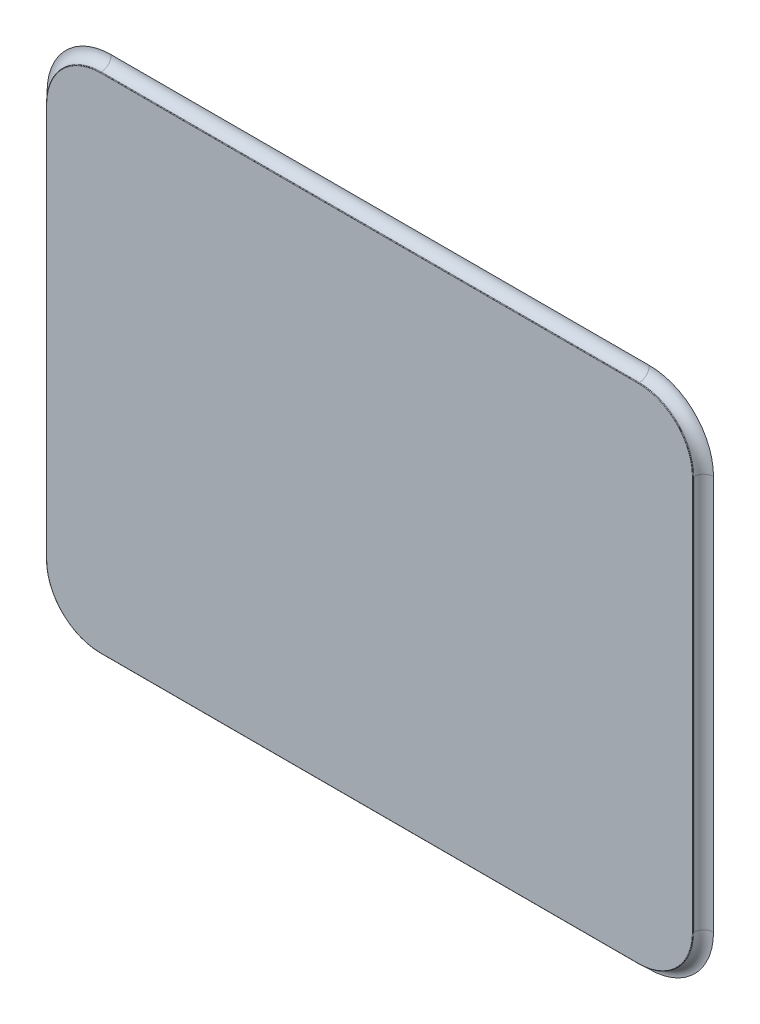
ISO-10303-21;
HEADER;
FILE_DESCRIPTION(('STEP AP214'),'2;1');
FILE_NAME('part.step','',(''),(''),'','','');
FILE_SCHEMA(('AUTOMOTIVE_DESIGN { 1 0 10303 214 1 1 1 1 }'));
ENDSEC;
DATA;
#1=APPLICATION_CONTEXT('core data for automotive mechanical design processes');
#2=APPLICATION_PROTOCOL_DEFINITION('international standard','automotive_design',2000,#1);
#3=PRODUCT_CONTEXT('',#1,'mechanical');
#4=PRODUCT('Part','Part','',(#3));
#5=PRODUCT_RELATED_PRODUCT_CATEGORY('part','',(#4));
#6=PRODUCT_DEFINITION_FORMATION('','',#4);
#7=PRODUCT_DEFINITION_CONTEXT('part definition',#1,'design');
#8=PRODUCT_DEFINITION('design','',#6,#7);
#9=PRODUCT_DEFINITION_SHAPE('','',#8);
#10=(LENGTH_UNIT() NAMED_UNIT(*) SI_UNIT(.MILLI.,.METRE.));
#11=(NAMED_UNIT(*) PLANE_ANGLE_UNIT() SI_UNIT($,.RADIAN.));
#12=(NAMED_UNIT(*) SI_UNIT($,.STERADIAN.) SOLID_ANGLE_UNIT());
#13=UNCERTAINTY_MEASURE_WITH_UNIT(LENGTH_MEASURE(1.E-05),#10,'distance_accuracy_value','');
#14=(GEOMETRIC_REPRESENTATION_CONTEXT(3) GLOBAL_UNCERTAINTY_ASSIGNED_CONTEXT((#13)) GLOBAL_UNIT_ASSIGNED_CONTEXT((#10,
#11,#12)) REPRESENTATION_CONTEXT('',''));
#15=CARTESIAN_POINT('',(0.,0.,0.));
#16=DIRECTION('',(0.,0.,1.));
#17=DIRECTION('',(1.,0.,0.));
#18=AXIS2_PLACEMENT_3D('',#15,#16,#17);
#19=CARTESIAN_POINT('',(-0.9015,-0.7015,0.3));
#20=DIRECTION('',(0.,1.,0.));
#21=DIRECTION('',(0.,0.,1.));
#22=AXIS2_PLACEMENT_3D('',#19,#20,#21);
#23=PLANE('',#22);
#24=DIRECTION('',(0.,0.,1.));
#25=VECTOR('',#24,1.);
#26=CARTESIAN_POINT('',(-0.75,-0.7015,0.3));
#27=LINE('',#26,#25);
#28=CARTESIAN_POINT('',(-0.75,-0.7015,0.3275));
#29=VERTEX_POINT('',#28);
#30=CARTESIAN_POINT('',(-0.75,-0.7015,0.3285));
#31=VERTEX_POINT('',#30);
#32=EDGE_CURVE('E34',#29,#31,#27,.T.);
#33=ORIENTED_EDGE('',*,*,#32,.F.);
#34=DIRECTION('',(1.,0.,0.));
#35=VECTOR('',#34,1.);
#36=CARTESIAN_POINT('',(-0.75,-0.7015,0.3275));
#37=LINE('',#36,#35);
#38=CARTESIAN_POINT('',(0.75,-0.7015,0.3275));
#39=VERTEX_POINT('',#38);
#40=EDGE_CURVE('E10',#29,#39,#37,.T.);
#41=ORIENTED_EDGE('',*,*,#40,.T.);
#42=DIRECTION('',(0.,0.,1.));
#43=VECTOR('',#42,1.);
#44=CARTESIAN_POINT('',(0.75,-0.7015,0.3));
#45=LINE('',#44,#43);
#46=CARTESIAN_POINT('',(0.75,-0.7015,0.3285));
#47=VERTEX_POINT('',#46);
#48=EDGE_CURVE('E26',#39,#47,#45,.T.);
#49=ORIENTED_EDGE('',*,*,#48,.T.);
#50=DIRECTION('',(1.,0.,0.));
#51=VECTOR('',#50,1.);
#52=CARTESIAN_POINT('',(-0.75,-0.7015,0.3285));
#53=LINE('',#52,#51);
#54=EDGE_CURVE('E282',#31,#47,#53,.T.);
#55=ORIENTED_EDGE('',*,*,#54,.F.);
#56=EDGE_LOOP('',(#33,#41,#49,#55));
#57=FACE_BOUND('',#56,.T.);
#58=ADVANCED_FACE('F16',(#57),#23,.F.);
#59=CARTESIAN_POINT('',(-0.75,-0.55,0.3));
#60=DIRECTION('',(0.,0.,1.));
#61=DIRECTION('',(1.,0.,0.));
#62=AXIS2_PLACEMENT_3D('',#59,#60,#61);
#63=CYLINDRICAL_SURFACE('',#62,0.1515);
#64=DIRECTION('',(0.,0.,1.));
#65=VECTOR('',#64,1.);
#66=CARTESIAN_POINT('',(-0.9015,-0.55,0.3));
#67=LINE('',#66,#65);
#68=CARTESIAN_POINT('',(-0.9015,-0.55,0.3275));
#69=VERTEX_POINT('',#68);
#70=CARTESIAN_POINT('',(-0.9015,-0.55,0.3285));
#71=VERTEX_POINT('',#70);
#72=EDGE_CURVE('E258',#69,#71,#67,.T.);
#73=ORIENTED_EDGE('',*,*,#72,.F.);
#74=CARTESIAN_POINT('',(-0.75,-0.55,0.3275));
#75=DIRECTION('',(0.,0.,1.));
#76=DIRECTION('',(1.,0.,0.));
#77=AXIS2_PLACEMENT_3D('',#74,#75,#76);
#78=CIRCLE('',#77,0.1515);
#79=EDGE_CURVE('E286',#69,#29,#78,.T.);
#80=ORIENTED_EDGE('',*,*,#79,.T.);
#81=ORIENTED_EDGE('',*,*,#32,.T.);
#82=CARTESIAN_POINT('',(-0.75,-0.55,0.3285));
#83=DIRECTION('',(0.,0.,1.));
#84=DIRECTION('',(1.,0.,0.));
#85=AXIS2_PLACEMENT_3D('',#82,#83,#84);
#86=CIRCLE('',#85,0.1515);
#87=EDGE_CURVE('E259',#71,#31,#86,.T.);
#88=ORIENTED_EDGE('',*,*,#87,.F.);
#89=EDGE_LOOP('',(#73,#80,#81,#88));
#90=FACE_BOUND('',#89,.T.);
#91=ADVANCED_FACE('F298',(#90),#63,.T.);
#92=CARTESIAN_POINT('',(-0.75,-0.7,0.3285));
#93=DIRECTION('',(1.,0.,0.));
#94=DIRECTION('',(0.,1.,0.));
#95=AXIS2_PLACEMENT_3D('',#92,#93,#94);
#96=CYLINDRICAL_SURFACE('',#95,0.0015);
#97=CARTESIAN_POINT('',(-0.75,-0.7,0.3285));
#98=DIRECTION('',(-1.,0.,0.));
#99=DIRECTION('',(0.,0.,1.));
#100=AXIS2_PLACEMENT_3D('',#97,#98,#99);
#101=CIRCLE('',#100,0.0015);
#102=CARTESIAN_POINT('',(-0.75,-0.7,0.33));
#103=VERTEX_POINT('',#102);
#104=EDGE_CURVE('E249',#31,#103,#101,.T.);
#105=ORIENTED_EDGE('',*,*,#104,.F.);
#106=ORIENTED_EDGE('',*,*,#54,.T.);
#107=CARTESIAN_POINT('',(0.75,-0.7,0.3285));
#108=DIRECTION('',(-1.,0.,0.));
#109=DIRECTION('',(0.,0.,1.));
#110=AXIS2_PLACEMENT_3D('',#107,#108,#109);
#111=CIRCLE('',#110,0.0015);
#112=CARTESIAN_POINT('',(0.75,-0.7,0.33));
#113=VERTEX_POINT('',#112);
#114=EDGE_CURVE('E276',#47,#113,#111,.T.);
#115=ORIENTED_EDGE('',*,*,#114,.T.);
#116=DIRECTION('',(1.,0.,0.));
#117=VECTOR('',#116,1.);
#118=CARTESIAN_POINT('',(-0.75,-0.7,0.33));
#119=LINE('',#118,#117);
#120=EDGE_CURVE('E245',#103,#113,#119,.T.);
#121=ORIENTED_EDGE('',*,*,#120,.F.);
#122=EDGE_LOOP('',(#105,#106,#115,#121));
#123=FACE_BOUND('',#122,.T.);
#124=ADVANCED_FACE('F302',(#123),#96,.T.);
#125=CARTESIAN_POINT('',(-0.75,-0.729,0.3275));
#126=DIRECTION('',(1.,0.,0.));
#127=DIRECTION('',(0.,1.,0.));
#128=AXIS2_PLACEMENT_3D('',#125,#126,#127);
#129=CYLINDRICAL_SURFACE('',#128,0.0275);
#130=CARTESIAN_POINT('',(-0.75,-0.729,0.3275));
#131=DIRECTION('',(1.,0.,0.));
#132=DIRECTION('',(0.,1.,0.));
#133=AXIS2_PLACEMENT_3D('',#130,#131,#132);
#134=CIRCLE('',#133,0.0275);
#135=CARTESIAN_POINT('',(-0.75,-0.729,0.3));
#136=VERTEX_POINT('',#135);
#137=EDGE_CURVE('E250',#136,#29,#134,.T.);
#138=ORIENTED_EDGE('',*,*,#137,.F.);
#139=DIRECTION('',(1.,0.,0.));
#140=VECTOR('',#139,1.);
#141=CARTESIAN_POINT('',(-0.75,-0.729,0.3));
#142=LINE('',#141,#140);
#143=CARTESIAN_POINT('',(0.75,-0.729,0.3));
#144=VERTEX_POINT('',#143);
#145=EDGE_CURVE('E273',#136,#144,#142,.T.);
#146=ORIENTED_EDGE('',*,*,#145,.T.);
#147=CARTESIAN_POINT('',(0.75,-0.729,0.3275));
#148=DIRECTION('',(1.,0.,0.));
#149=DIRECTION('',(0.,1.,0.));
#150=AXIS2_PLACEMENT_3D('',#147,#148,#149);
#151=CIRCLE('',#150,0.0275);
#152=EDGE_CURVE('E271',#144,#39,#151,.T.);
#153=ORIENTED_EDGE('',*,*,#152,.T.);
#154=ORIENTED_EDGE('',*,*,#40,.F.);
#155=EDGE_LOOP('',(#138,#146,#153,#154));
#156=FACE_BOUND('',#155,.T.);
#157=ADVANCED_FACE('F341',(#156),#129,.F.);
#158=CARTESIAN_POINT('',(0.75,-0.55,0.3));
#159=DIRECTION('',(0.,0.,1.));
#160=DIRECTION('',(1.,0.,0.));
#161=AXIS2_PLACEMENT_3D('',#158,#159,#160);
#162=CYLINDRICAL_SURFACE('',#161,0.1515);
#163=DIRECTION('',(0.,0.,1.));
#164=VECTOR('',#163,1.);
#165=CARTESIAN_POINT('',(0.9015,-0.55,0.3));
#166=LINE('',#165,#164);
#167=CARTESIAN_POINT('',(0.9015,-0.55,0.3275));
#168=VERTEX_POINT('',#167);
#169=CARTESIAN_POINT('',(0.9015,-0.55,0.3285));
#170=VERTEX_POINT('',#169);
#171=EDGE_CURVE('E266',#168,#170,#166,.T.);
#172=ORIENTED_EDGE('',*,*,#171,.T.);
#173=CARTESIAN_POINT('',(0.75,-0.55,0.3285));
#174=DIRECTION('',(0.,0.,1.));
#175=DIRECTION('',(1.,0.,0.));
#176=AXIS2_PLACEMENT_3D('',#173,#174,#175);
#177=CIRCLE('',#176,0.1515);
#178=EDGE_CURVE('E225',#47,#170,#177,.T.);
#179=ORIENTED_EDGE('',*,*,#178,.F.);
#180=ORIENTED_EDGE('',*,*,#48,.F.);
#181=CARTESIAN_POINT('',(0.75,-0.55,0.3275));
#182=DIRECTION('',(0.,0.,1.));
#183=DIRECTION('',(1.,0.,0.));
#184=AXIS2_PLACEMENT_3D('',#181,#182,#183);
#185=CIRCLE('',#184,0.1515);
#186=EDGE_CURVE('E263',#39,#168,#185,.T.);
#187=ORIENTED_EDGE('',*,*,#186,.T.);
#188=EDGE_LOOP('',(#172,#179,#180,#187));
#189=FACE_BOUND('',#188,.T.);
#190=ADVANCED_FACE('F338',(#189),#162,.T.);
#191=CARTESIAN_POINT('',(-0.9015,-0.7015,0.3));
#192=DIRECTION('',(1.,0.,0.));
#193=DIRECTION('',(0.,0.,-1.));
#194=AXIS2_PLACEMENT_3D('',#191,#192,#193);
#195=PLANE('',#194);
#196=ORIENTED_EDGE('',*,*,#72,.T.);
#197=DIRECTION('',(0.,-1.,0.));
#198=VECTOR('',#197,1.);
#199=CARTESIAN_POINT('',(-0.9015,0.55,0.3285));
#200=LINE('',#199,#198);
#201=CARTESIAN_POINT('',(-0.9015,0.55,0.3285));
#202=VERTEX_POINT('',#201);
#203=EDGE_CURVE('E207',#202,#71,#200,.T.);
#204=ORIENTED_EDGE('',*,*,#203,.F.);
#205=DIRECTION('',(0.,0.,1.));
#206=VECTOR('',#205,1.);
#207=CARTESIAN_POINT('',(-0.9015,0.55,0.3));
#208=LINE('',#207,#206);
#209=CARTESIAN_POINT('',(-0.9015,0.55,0.3275));
#210=VERTEX_POINT('',#209);
#211=EDGE_CURVE('E172',#210,#202,#208,.T.);
#212=ORIENTED_EDGE('',*,*,#211,.F.);
#213=DIRECTION('',(0.,-1.,0.));
#214=VECTOR('',#213,1.);
#215=CARTESIAN_POINT('',(-0.9015,0.55,0.3275));
#216=LINE('',#215,#214);
#217=EDGE_CURVE('E256',#210,#69,#216,.T.);
#218=ORIENTED_EDGE('',*,*,#217,.T.);
#219=EDGE_LOOP('',(#196,#204,#212,#218));
#220=FACE_BOUND('',#219,.T.);
#221=ADVANCED_FACE('F314',(#220),#195,.F.);
#222=CARTESIAN_POINT('',(-0.75,-0.55,0.3285));
#223=DIRECTION('',(0.,0.,1.));
#224=DIRECTION('',(1.,0.,0.));
#225=AXIS2_PLACEMENT_3D('',#222,#223,#224);
#226=TOROIDAL_SURFACE('',#225,0.15,0.0015);
#227=CARTESIAN_POINT('',(-0.9,-0.55,0.3285));
#228=DIRECTION('',(0.,1.,0.));
#229=DIRECTION('',(1.,0.,0.));
#230=AXIS2_PLACEMENT_3D('',#227,#228,#229);
#231=CIRCLE('',#230,0.0015);
#232=CARTESIAN_POINT('',(-0.9,-0.55,0.33));
#233=VERTEX_POINT('',#232);
#234=EDGE_CURVE('E221',#71,#233,#231,.T.);
#235=ORIENTED_EDGE('',*,*,#234,.F.);
#236=ORIENTED_EDGE('',*,*,#87,.T.);
#237=ORIENTED_EDGE('',*,*,#104,.T.);
#238=CARTESIAN_POINT('',(-0.75,-0.55,0.33));
#239=DIRECTION('',(0.,0.,1.));
#240=DIRECTION('',(1.,0.,0.));
#241=AXIS2_PLACEMENT_3D('',#238,#239,#240);
#242=CIRCLE('',#241,0.15);
#243=EDGE_CURVE('E230',#233,#103,#242,.T.);
#244=ORIENTED_EDGE('',*,*,#243,.F.);
#245=EDGE_LOOP('',(#235,#236,#237,#244));
#246=FACE_BOUND('',#245,.T.);
#247=ADVANCED_FACE('F306',(#246),#226,.T.);
#248=CARTESIAN_POINT('',(-0.75,-0.55,0.3275));
#249=DIRECTION('',(0.,0.,-1.));
#250=DIRECTION('',(0.,-1.,0.));
#251=AXIS2_PLACEMENT_3D('',#248,#249,#250);
#252=TOROIDAL_SURFACE('',#251,0.179,0.0275);
#253=CARTESIAN_POINT('',(-0.929,-0.55,0.3275));
#254=DIRECTION('',(0.,-1.,0.));
#255=DIRECTION('',(0.,0.,-1.));
#256=AXIS2_PLACEMENT_3D('',#253,#254,#255);
#257=CIRCLE('',#256,0.0275);
#258=CARTESIAN_POINT('',(-0.929,-0.55,0.3));
#259=VERTEX_POINT('',#258);
#260=EDGE_CURVE('E222',#259,#69,#257,.T.);
#261=ORIENTED_EDGE('',*,*,#260,.F.);
#262=CARTESIAN_POINT('',(-0.75,-0.55,0.3));
#263=DIRECTION('',(0.,0.,1.));
#264=DIRECTION('',(1.,0.,0.));
#265=AXIS2_PLACEMENT_3D('',#262,#263,#264);
#266=CIRCLE('',#265,0.179);
#267=EDGE_CURVE('E246',#259,#136,#266,.T.);
#268=ORIENTED_EDGE('',*,*,#267,.T.);
#269=ORIENTED_EDGE('',*,*,#137,.T.);
#270=ORIENTED_EDGE('',*,*,#79,.F.);
#271=EDGE_LOOP('',(#261,#268,#269,#270));
#272=FACE_BOUND('',#271,.T.);
#273=ADVANCED_FACE('F344',(#272),#252,.F.);
#274=CARTESIAN_POINT('',(-0.9015,-0.7015,0.33));
#275=DIRECTION('',(0.,0.,1.));
#276=DIRECTION('',(1.,0.,0.));
#277=AXIS2_PLACEMENT_3D('',#274,#275,#276);
#278=PLANE('',#277);
#279=ORIENTED_EDGE('',*,*,#120,.T.);
#280=CARTESIAN_POINT('',(0.75,-0.55,0.33));
#281=DIRECTION('',(0.,0.,1.));
#282=DIRECTION('',(1.,0.,0.));
#283=AXIS2_PLACEMENT_3D('',#280,#281,#282);
#284=CIRCLE('',#283,0.15);
#285=CARTESIAN_POINT('',(0.9,-0.55,0.33));
#286=VERTEX_POINT('',#285);
#287=EDGE_CURVE('E242',#113,#286,#284,.T.);
#288=ORIENTED_EDGE('',*,*,#287,.T.);
#289=DIRECTION('',(0.,1.,0.));
#290=VECTOR('',#289,1.);
#291=CARTESIAN_POINT('',(0.9,-0.55,0.33));
#292=LINE('',#291,#290);
#293=CARTESIAN_POINT('',(0.9,0.55,0.33));
#294=VERTEX_POINT('',#293);
#295=EDGE_CURVE('E239',#286,#294,#292,.T.);
#296=ORIENTED_EDGE('',*,*,#295,.T.);
#297=CARTESIAN_POINT('',(0.75,0.55,0.33));
#298=DIRECTION('',(0.,0.,1.));
#299=DIRECTION('',(1.,0.,0.));
#300=AXIS2_PLACEMENT_3D('',#297,#298,#299);
#301=CIRCLE('',#300,0.15);
#302=CARTESIAN_POINT('',(0.75,0.7,0.33));
#303=VERTEX_POINT('',#302);
#304=EDGE_CURVE('E236',#294,#303,#301,.T.);
#305=ORIENTED_EDGE('',*,*,#304,.T.);
#306=DIRECTION('',(-1.,0.,0.));
#307=VECTOR('',#306,1.);
#308=CARTESIAN_POINT('',(0.75,0.7,0.33));
#309=LINE('',#308,#307);
#310=CARTESIAN_POINT('',(-0.75,0.7,0.33));
#311=VERTEX_POINT('',#310);
#312=EDGE_CURVE('E233',#303,#311,#309,.T.);
#313=ORIENTED_EDGE('',*,*,#312,.T.);
#314=CARTESIAN_POINT('',(-0.75,0.55,0.33));
#315=DIRECTION('',(0.,0.,1.));
#316=DIRECTION('',(1.,0.,0.));
#317=AXIS2_PLACEMENT_3D('',#314,#315,#316);
#318=CIRCLE('',#317,0.15);
#319=CARTESIAN_POINT('',(-0.9,0.55,0.33));
#320=VERTEX_POINT('',#319);
#321=EDGE_CURVE('E229',#311,#320,#318,.T.);
#322=ORIENTED_EDGE('',*,*,#321,.T.);
#323=DIRECTION('',(0.,-1.,0.));
#324=VECTOR('',#323,1.);
#325=CARTESIAN_POINT('',(-0.9,0.55,0.33));
#326=LINE('',#325,#324);
#327=EDGE_CURVE('E226',#320,#233,#326,.T.);
#328=ORIENTED_EDGE('',*,*,#327,.T.);
#329=ORIENTED_EDGE('',*,*,#243,.T.);
#330=EDGE_LOOP('',(#279,#288,#296,#305,#313,#322,#328,#329));
#331=FACE_BOUND('',#330,.T.);
#332=ADVANCED_FACE('F308',(#331),#278,.T.);
#333=CARTESIAN_POINT('',(0.75,-0.55,0.3285));
#334=DIRECTION('',(0.,0.,1.));
#335=DIRECTION('',(1.,0.,0.));
#336=AXIS2_PLACEMENT_3D('',#333,#334,#335);
#337=TOROIDAL_SURFACE('',#336,0.15,0.0015);
#338=ORIENTED_EDGE('',*,*,#114,.F.);
#339=ORIENTED_EDGE('',*,*,#178,.T.);
#340=CARTESIAN_POINT('',(0.9,-0.55,0.3285));
#341=DIRECTION('',(0.,-1.,0.));
#342=DIRECTION('',(-1.,0.,0.));
#343=AXIS2_PLACEMENT_3D('',#340,#341,#342);
#344=CIRCLE('',#343,0.0015);
#345=EDGE_CURVE('E201',#170,#286,#344,.T.);
#346=ORIENTED_EDGE('',*,*,#345,.T.);
#347=ORIENTED_EDGE('',*,*,#287,.F.);
#348=EDGE_LOOP('',(#338,#339,#346,#347));
#349=FACE_BOUND('',#348,.T.);
#350=ADVANCED_FACE('F377',(#349),#337,.T.);
#351=CARTESIAN_POINT('',(-1.,-0.8,0.3));
#352=DIRECTION('',(0.,0.,1.));
#353=DIRECTION('',(1.,0.,0.));
#354=AXIS2_PLACEMENT_3D('',#351,#352,#353);
#355=PLANE('',#354);
#356=ORIENTED_EDGE('',*,*,#267,.F.);
#357=DIRECTION('',(0.,-1.,0.));
#358=VECTOR('',#357,1.);
#359=CARTESIAN_POINT('',(-0.929,0.55,0.3));
#360=LINE('',#359,#358);
#361=CARTESIAN_POINT('',(-0.929,0.55,0.3));
#362=VERTEX_POINT('',#361);
#363=EDGE_CURVE('E218',#362,#259,#360,.T.);
#364=ORIENTED_EDGE('',*,*,#363,.F.);
#365=CARTESIAN_POINT('',(-0.75,0.55,0.3));
#366=DIRECTION('',(0.,0.,1.));
#367=DIRECTION('',(1.,0.,0.));
#368=AXIS2_PLACEMENT_3D('',#365,#366,#367);
#369=CIRCLE('',#368,0.179);
#370=CARTESIAN_POINT('',(-0.75,0.729,0.3));
#371=VERTEX_POINT('',#370);
#372=EDGE_CURVE('E180',#371,#362,#369,.T.);
#373=ORIENTED_EDGE('',*,*,#372,.F.);
#374=DIRECTION('',(-1.,0.,0.));
#375=VECTOR('',#374,1.);
#376=CARTESIAN_POINT('',(0.75,0.729,0.3));
#377=LINE('',#376,#375);
#378=CARTESIAN_POINT('',(0.75,0.729,0.3));
#379=VERTEX_POINT('',#378);
#380=EDGE_CURVE('E189',#379,#371,#377,.T.);
#381=ORIENTED_EDGE('',*,*,#380,.F.);
#382=CARTESIAN_POINT('',(0.75,0.55,0.3));
#383=DIRECTION('',(0.,0.,1.));
#384=DIRECTION('',(1.,0.,0.));
#385=AXIS2_PLACEMENT_3D('',#382,#383,#384);
#386=CIRCLE('',#385,0.179);
#387=CARTESIAN_POINT('',(0.929,0.55,0.3));
#388=VERTEX_POINT('',#387);
#389=EDGE_CURVE('E158',#388,#379,#386,.T.);
#390=ORIENTED_EDGE('',*,*,#389,.F.);
#391=DIRECTION('',(0.,1.,0.));
#392=VECTOR('',#391,1.);
#393=CARTESIAN_POINT('',(0.929,-0.55,0.3));
#394=LINE('',#393,#392);
#395=CARTESIAN_POINT('',(0.929,-0.55,0.3));
#396=VERTEX_POINT('',#395);
#397=EDGE_CURVE('E160',#396,#388,#394,.T.);
#398=ORIENTED_EDGE('',*,*,#397,.F.);
#399=CARTESIAN_POINT('',(0.75,-0.55,0.3));
#400=DIRECTION('',(0.,0.,1.));
#401=DIRECTION('',(1.,0.,0.));
#402=AXIS2_PLACEMENT_3D('',#399,#400,#401);
#403=CIRCLE('',#402,0.179);
#404=EDGE_CURVE('E198',#144,#396,#403,.T.);
#405=ORIENTED_EDGE('',*,*,#404,.F.);
#406=ORIENTED_EDGE('',*,*,#145,.F.);
#407=EDGE_LOOP('',(#356,#364,#373,#381,#390,#398,#405,#406));
#408=FACE_BOUND('',#407,.T.);
#409=ADVANCED_FACE('F348',(#408),#355,.F.);
#410=CARTESIAN_POINT('',(0.75,-0.55,0.3275));
#411=DIRECTION('',(0.,0.,-1.));
#412=DIRECTION('',(0.,-1.,0.));
#413=AXIS2_PLACEMENT_3D('',#410,#411,#412);
#414=TOROIDAL_SURFACE('',#413,0.179,0.0275);
#415=ORIENTED_EDGE('',*,*,#152,.F.);
#416=ORIENTED_EDGE('',*,*,#404,.T.);
#417=CARTESIAN_POINT('',(0.929,-0.55,0.3275));
#418=DIRECTION('',(0.,1.,0.));
#419=DIRECTION('',(1.,0.,0.));
#420=AXIS2_PLACEMENT_3D('',#417,#418,#419);
#421=CIRCLE('',#420,0.0275);
#422=EDGE_CURVE('E202',#396,#168,#421,.T.);
#423=ORIENTED_EDGE('',*,*,#422,.T.);
#424=ORIENTED_EDGE('',*,*,#186,.F.);
#425=EDGE_LOOP('',(#415,#416,#423,#424));
#426=FACE_BOUND('',#425,.T.);
#427=ADVANCED_FACE('F334',(#426),#414,.F.);
#428=CARTESIAN_POINT('',(0.9015,-0.7015,0.3));
#429=DIRECTION('',(1.,0.,0.));
#430=DIRECTION('',(0.,0.,-1.));
#431=AXIS2_PLACEMENT_3D('',#428,#429,#430);
#432=PLANE('',#431);
#433=ORIENTED_EDGE('',*,*,#171,.F.);
#434=DIRECTION('',(0.,1.,0.));
#435=VECTOR('',#434,1.);
#436=CARTESIAN_POINT('',(0.9015,-0.55,0.3275));
#437=LINE('',#436,#435);
#438=CARTESIAN_POINT('',(0.9015,0.55,0.3275));
#439=VERTEX_POINT('',#438);
#440=EDGE_CURVE('E204',#168,#439,#437,.T.);
#441=ORIENTED_EDGE('',*,*,#440,.T.);
#442=DIRECTION('',(0.,0.,1.));
#443=VECTOR('',#442,1.);
#444=CARTESIAN_POINT('',(0.9015,0.55,0.3));
#445=LINE('',#444,#443);
#446=CARTESIAN_POINT('',(0.9015,0.55,0.3285));
#447=VERTEX_POINT('',#446);
#448=EDGE_CURVE('E151',#439,#447,#445,.T.);
#449=ORIENTED_EDGE('',*,*,#448,.T.);
#450=DIRECTION('',(0.,1.,0.));
#451=VECTOR('',#450,1.);
#452=CARTESIAN_POINT('',(0.9015,-0.55,0.3285));
#453=LINE('',#452,#451);
#454=EDGE_CURVE('E173',#170,#447,#453,.T.);
#455=ORIENTED_EDGE('',*,*,#454,.F.);
#456=EDGE_LOOP('',(#433,#441,#449,#455));
#457=FACE_BOUND('',#456,.T.);
#458=ADVANCED_FACE('F330',(#457),#432,.T.);
#459=CARTESIAN_POINT('',(-0.9,0.55,0.3285));
#460=DIRECTION('',(0.,-1.,0.));
#461=DIRECTION('',(0.,0.,-1.));
#462=AXIS2_PLACEMENT_3D('',#459,#460,#461);
#463=CYLINDRICAL_SURFACE('',#462,0.0015);
#464=CARTESIAN_POINT('',(-0.9,0.55,0.3285));
#465=DIRECTION('',(0.,1.,0.));
#466=DIRECTION('',(1.,0.,0.));
#467=AXIS2_PLACEMENT_3D('',#464,#465,#466);
#468=CIRCLE('',#467,0.0015);
#469=EDGE_CURVE('E184',#202,#320,#468,.T.);
#470=ORIENTED_EDGE('',*,*,#469,.F.);
#471=ORIENTED_EDGE('',*,*,#203,.T.);
#472=ORIENTED_EDGE('',*,*,#234,.T.);
#473=ORIENTED_EDGE('',*,*,#327,.F.);
#474=EDGE_LOOP('',(#470,#471,#472,#473));
#475=FACE_BOUND('',#474,.T.);
#476=ADVANCED_FACE('F310',(#475),#463,.T.);
#477=CARTESIAN_POINT('',(-0.929,0.55,0.3275));
#478=DIRECTION('',(0.,-1.,0.));
#479=DIRECTION('',(0.,0.,-1.));
#480=AXIS2_PLACEMENT_3D('',#477,#478,#479);
#481=CYLINDRICAL_SURFACE('',#480,0.0275);
#482=CARTESIAN_POINT('',(-0.929,0.55,0.3275));
#483=DIRECTION('',(0.,-1.,0.));
#484=DIRECTION('',(-1.,0.,0.));
#485=AXIS2_PLACEMENT_3D('',#482,#483,#484);
#486=CIRCLE('',#485,0.0275);
#487=EDGE_CURVE('E211',#362,#210,#486,.T.);
#488=ORIENTED_EDGE('',*,*,#487,.F.);
#489=ORIENTED_EDGE('',*,*,#363,.T.);
#490=ORIENTED_EDGE('',*,*,#260,.T.);
#491=ORIENTED_EDGE('',*,*,#217,.F.);
#492=EDGE_LOOP('',(#488,#489,#490,#491));
#493=FACE_BOUND('',#492,.T.);
#494=ADVANCED_FACE('F350',(#493),#481,.F.);
#495=CARTESIAN_POINT('',(-0.75,0.55,0.3));
#496=DIRECTION('',(0.,0.,1.));
#497=DIRECTION('',(1.,0.,0.));
#498=AXIS2_PLACEMENT_3D('',#495,#496,#497);
#499=CYLINDRICAL_SURFACE('',#498,0.1515);
#500=ORIENTED_EDGE('',*,*,#211,.T.);
#501=CARTESIAN_POINT('',(-0.75,0.55,0.3285));
#502=DIRECTION('',(0.,0.,1.));
#503=DIRECTION('',(1.,0.,0.));
#504=AXIS2_PLACEMENT_3D('',#501,#502,#503);
#505=CIRCLE('',#504,0.1515);
#506=CARTESIAN_POINT('',(-0.75,0.7015,0.3285));
#507=VERTEX_POINT('',#506);
#508=EDGE_CURVE('E167',#507,#202,#505,.T.);
#509=ORIENTED_EDGE('',*,*,#508,.F.);
#510=DIRECTION('',(0.,0.,1.));
#511=VECTOR('',#510,1.);
#512=CARTESIAN_POINT('',(-0.75,0.7015,0.3));
#513=LINE('',#512,#511);
#514=CARTESIAN_POINT('',(-0.75,0.7015,0.3275));
#515=VERTEX_POINT('',#514);
#516=EDGE_CURVE('E141',#515,#507,#513,.T.);
#517=ORIENTED_EDGE('',*,*,#516,.F.);
#518=CARTESIAN_POINT('',(-0.75,0.55,0.3275));
#519=DIRECTION('',(0.,0.,1.));
#520=DIRECTION('',(1.,0.,0.));
#521=AXIS2_PLACEMENT_3D('',#518,#519,#520);
#522=CIRCLE('',#521,0.1515);
#523=EDGE_CURVE('E169',#515,#210,#522,.T.);
#524=ORIENTED_EDGE('',*,*,#523,.T.);
#525=EDGE_LOOP('',(#500,#509,#517,#524));
#526=FACE_BOUND('',#525,.T.);
#527=ADVANCED_FACE('F320',(#526),#499,.T.);
#528=CARTESIAN_POINT('',(0.9,-0.55,0.3285));
#529=DIRECTION('',(0.,1.,0.));
#530=DIRECTION('',(1.,0.,0.));
#531=AXIS2_PLACEMENT_3D('',#528,#529,#530);
#532=CYLINDRICAL_SURFACE('',#531,0.0015);
#533=ORIENTED_EDGE('',*,*,#345,.F.);
#534=ORIENTED_EDGE('',*,*,#454,.T.);
#535=CARTESIAN_POINT('',(0.9,0.55,0.3285));
#536=DIRECTION('',(0.,-1.,0.));
#537=DIRECTION('',(0.,0.,-1.));
#538=AXIS2_PLACEMENT_3D('',#535,#536,#537);
#539=CIRCLE('',#538,0.0015);
#540=EDGE_CURVE('E174',#447,#294,#539,.T.);
#541=ORIENTED_EDGE('',*,*,#540,.T.);
#542=ORIENTED_EDGE('',*,*,#295,.F.);
#543=EDGE_LOOP('',(#533,#534,#541,#542));
#544=FACE_BOUND('',#543,.T.);
#545=ADVANCED_FACE('F327',(#544),#532,.T.);
#546=CARTESIAN_POINT('',(-0.75,0.55,0.3285));
#547=DIRECTION('',(0.,0.,1.));
#548=DIRECTION('',(1.,0.,0.));
#549=AXIS2_PLACEMENT_3D('',#546,#547,#548);
#550=TOROIDAL_SURFACE('',#549,0.15,0.0015);
#551=CARTESIAN_POINT('',(-0.75,0.7,0.3285));
#552=DIRECTION('',(1.,0.,0.));
#553=DIRECTION('',(0.,1.,0.));
#554=AXIS2_PLACEMENT_3D('',#551,#552,#553);
#555=CIRCLE('',#554,0.0015);
#556=EDGE_CURVE('E177',#507,#311,#555,.T.);
#557=ORIENTED_EDGE('',*,*,#556,.F.);
#558=ORIENTED_EDGE('',*,*,#508,.T.);
#559=ORIENTED_EDGE('',*,*,#469,.T.);
#560=ORIENTED_EDGE('',*,*,#321,.F.);
#561=EDGE_LOOP('',(#557,#558,#559,#560));
#562=FACE_BOUND('',#561,.T.);
#563=ADVANCED_FACE('F318',(#562),#550,.T.);
#564=CARTESIAN_POINT('',(0.75,0.55,0.3285));
#565=DIRECTION('',(0.,0.,1.));
#566=DIRECTION('',(1.,0.,0.));
#567=AXIS2_PLACEMENT_3D('',#564,#565,#566);
#568=TOROIDAL_SURFACE('',#567,0.15,0.0015);
#569=ORIENTED_EDGE('',*,*,#540,.F.);
#570=CARTESIAN_POINT('',(0.75,0.55,0.3285));
#571=DIRECTION('',(0.,0.,1.));
#572=DIRECTION('',(1.,0.,0.));
#573=AXIS2_PLACEMENT_3D('',#570,#571,#572);
#574=CIRCLE('',#573,0.1515);
#575=CARTESIAN_POINT('',(0.75,0.7015,0.3285));
#576=VERTEX_POINT('',#575);
#577=EDGE_CURVE('E181',#447,#576,#574,.T.);
#578=ORIENTED_EDGE('',*,*,#577,.T.);
#579=CARTESIAN_POINT('',(0.75,0.7,0.3285));
#580=DIRECTION('',(1.,0.,0.));
#581=DIRECTION('',(0.,0.,1.));
#582=AXIS2_PLACEMENT_3D('',#579,#580,#581);
#583=CIRCLE('',#582,0.0015);
#584=EDGE_CURVE('E185',#576,#303,#583,.T.);
#585=ORIENTED_EDGE('',*,*,#584,.T.);
#586=ORIENTED_EDGE('',*,*,#304,.F.);
#587=EDGE_LOOP('',(#569,#578,#585,#586));
#588=FACE_BOUND('',#587,.T.);
#589=ADVANCED_FACE('F324',(#588),#568,.T.);
#590=CARTESIAN_POINT('',(0.75,0.7,0.3285));
#591=DIRECTION('',(-1.,0.,0.));
#592=DIRECTION('',(0.,0.,1.));
#593=AXIS2_PLACEMENT_3D('',#590,#591,#592);
#594=CYLINDRICAL_SURFACE('',#593,0.0015);
#595=ORIENTED_EDGE('',*,*,#584,.F.);
#596=DIRECTION('',(-1.,0.,0.));
#597=VECTOR('',#596,1.);
#598=CARTESIAN_POINT('',(0.75,0.7015,0.3285));
#599=LINE('',#598,#597);
#600=EDGE_CURVE('E127',#576,#507,#599,.T.);
#601=ORIENTED_EDGE('',*,*,#600,.T.);
#602=ORIENTED_EDGE('',*,*,#556,.T.);
#603=ORIENTED_EDGE('',*,*,#312,.F.);
#604=EDGE_LOOP('',(#595,#601,#602,#603));
#605=FACE_BOUND('',#604,.T.);
#606=ADVANCED_FACE('F322',(#605),#594,.T.);
#607=CARTESIAN_POINT('',(-0.75,0.55,0.3275));
#608=DIRECTION('',(0.,0.,-1.));
#609=DIRECTION('',(0.,-1.,0.));
#610=AXIS2_PLACEMENT_3D('',#607,#608,#609);
#611=TOROIDAL_SURFACE('',#610,0.179,0.0275);
#612=CARTESIAN_POINT('',(-0.75,0.729,0.3275));
#613=DIRECTION('',(-1.,0.,0.));
#614=DIRECTION('',(0.,0.,1.));
#615=AXIS2_PLACEMENT_3D('',#612,#613,#614);
#616=CIRCLE('',#615,0.0275);
#617=EDGE_CURVE('E139',#371,#515,#616,.T.);
#618=ORIENTED_EDGE('',*,*,#617,.F.);
#619=ORIENTED_EDGE('',*,*,#372,.T.);
#620=ORIENTED_EDGE('',*,*,#487,.T.);
#621=ORIENTED_EDGE('',*,*,#523,.F.);
#622=EDGE_LOOP('',(#618,#619,#620,#621));
#623=FACE_BOUND('',#622,.T.);
#624=ADVANCED_FACE('F351',(#623),#611,.F.);
#625=CARTESIAN_POINT('',(0.75,0.729,0.3275));
#626=DIRECTION('',(-1.,0.,0.));
#627=DIRECTION('',(0.,0.,1.));
#628=AXIS2_PLACEMENT_3D('',#625,#626,#627);
#629=CYLINDRICAL_SURFACE('',#628,0.0275);
#630=CARTESIAN_POINT('',(0.75,0.729,0.3275));
#631=DIRECTION('',(-1.,0.,0.));
#632=DIRECTION('',(0.,0.,1.));
#633=AXIS2_PLACEMENT_3D('',#630,#631,#632);
#634=CIRCLE('',#633,0.0275);
#635=CARTESIAN_POINT('',(0.75,0.7015,0.3275));
#636=VERTEX_POINT('',#635);
#637=EDGE_CURVE('E137',#379,#636,#634,.T.);
#638=ORIENTED_EDGE('',*,*,#637,.F.);
#639=ORIENTED_EDGE('',*,*,#380,.T.);
#640=ORIENTED_EDGE('',*,*,#617,.T.);
#641=DIRECTION('',(-1.,0.,0.));
#642=VECTOR('',#641,1.);
#643=CARTESIAN_POINT('',(0.75,0.7015,0.3275));
#644=LINE('',#643,#642);
#645=EDGE_CURVE('E134',#636,#515,#644,.T.);
#646=ORIENTED_EDGE('',*,*,#645,.F.);
#647=EDGE_LOOP('',(#638,#639,#640,#646));
#648=FACE_BOUND('',#647,.T.);
#649=ADVANCED_FACE('F18',(#648),#629,.F.);
#650=CARTESIAN_POINT('',(0.75,0.55,0.3275));
#651=DIRECTION('',(0.,0.,-1.));
#652=DIRECTION('',(0.,-1.,0.));
#653=AXIS2_PLACEMENT_3D('',#650,#651,#652);
#654=TOROIDAL_SURFACE('',#653,0.179,0.0275);
#655=CARTESIAN_POINT('',(0.929,0.55,0.3275));
#656=DIRECTION('',(0.,1.,0.));
#657=DIRECTION('',(1.,0.,0.));
#658=AXIS2_PLACEMENT_3D('',#655,#656,#657);
#659=CIRCLE('',#658,0.0275);
#660=EDGE_CURVE('E155',#388,#439,#659,.T.);
#661=ORIENTED_EDGE('',*,*,#660,.F.);
#662=ORIENTED_EDGE('',*,*,#389,.T.);
#663=ORIENTED_EDGE('',*,*,#637,.T.);
#664=CARTESIAN_POINT('',(0.75,0.55,0.3275));
#665=DIRECTION('',(0.,0.,1.));
#666=DIRECTION('',(1.,0.,0.));
#667=AXIS2_PLACEMENT_3D('',#664,#665,#666);
#668=CIRCLE('',#667,0.1515);
#669=EDGE_CURVE('E147',#439,#636,#668,.T.);
#670=ORIENTED_EDGE('',*,*,#669,.F.);
#671=EDGE_LOOP('',(#661,#662,#663,#670));
#672=FACE_BOUND('',#671,.T.);
#673=ADVANCED_FACE('F156',(#672),#654,.F.);
#674=CARTESIAN_POINT('',(0.929,-0.55,0.3275));
#675=DIRECTION('',(0.,1.,0.));
#676=DIRECTION('',(1.,0.,0.));
#677=AXIS2_PLACEMENT_3D('',#674,#675,#676);
#678=CYLINDRICAL_SURFACE('',#677,0.0275);
#679=ORIENTED_EDGE('',*,*,#422,.F.);
#680=ORIENTED_EDGE('',*,*,#397,.T.);
#681=ORIENTED_EDGE('',*,*,#660,.T.);
#682=ORIENTED_EDGE('',*,*,#440,.F.);
#683=EDGE_LOOP('',(#679,#680,#681,#682));
#684=FACE_BOUND('',#683,.T.);
#685=ADVANCED_FACE('F331',(#684),#678,.F.);
#686=CARTESIAN_POINT('',(0.75,0.55,0.3));
#687=DIRECTION('',(0.,0.,1.));
#688=DIRECTION('',(1.,0.,0.));
#689=AXIS2_PLACEMENT_3D('',#686,#687,#688);
#690=CYLINDRICAL_SURFACE('',#689,0.1515);
#691=ORIENTED_EDGE('',*,*,#448,.F.);
#692=ORIENTED_EDGE('',*,*,#669,.T.);
#693=DIRECTION('',(0.,0.,1.));
#694=VECTOR('',#693,1.);
#695=CARTESIAN_POINT('',(0.75,0.7015,0.3));
#696=LINE('',#695,#694);
#697=EDGE_CURVE('E20',#636,#576,#696,.T.);
#698=ORIENTED_EDGE('',*,*,#697,.T.);
#699=ORIENTED_EDGE('',*,*,#577,.F.);
#700=EDGE_LOOP('',(#691,#692,#698,#699));
#701=FACE_BOUND('',#700,.T.);
#702=ADVANCED_FACE('F148',(#701),#690,.T.);
#703=CARTESIAN_POINT('',(-0.9015,0.7015,0.3));
#704=DIRECTION('',(0.,1.,0.));
#705=DIRECTION('',(0.,0.,1.));
#706=AXIS2_PLACEMENT_3D('',#703,#704,#705);
#707=PLANE('',#706);
#708=ORIENTED_EDGE('',*,*,#516,.T.);
#709=ORIENTED_EDGE('',*,*,#600,.F.);
#710=ORIENTED_EDGE('',*,*,#697,.F.);
#711=ORIENTED_EDGE('',*,*,#645,.T.);
#712=EDGE_LOOP('',(#708,#709,#710,#711));
#713=FACE_BOUND('',#712,.T.);
#714=ADVANCED_FACE('F162',(#713),#707,.T.);
#715=CLOSED_SHELL('',(#58,#91,#124,#157,#190,#221,#247,#273,#332,#350,#409,#427,#458,#476,#494,
#527,#545,#563,#589,#606,#624,#649,#673,#685,#702,#714));
#716=MANIFOLD_SOLID_BREP('B1',#715);
#717=ADVANCED_BREP_SHAPE_REPRESENTATION('',(#18,#716),#14);
#718=SHAPE_DEFINITION_REPRESENTATION(#9,#717);
ENDSEC;
END-ISO-10303-21;
